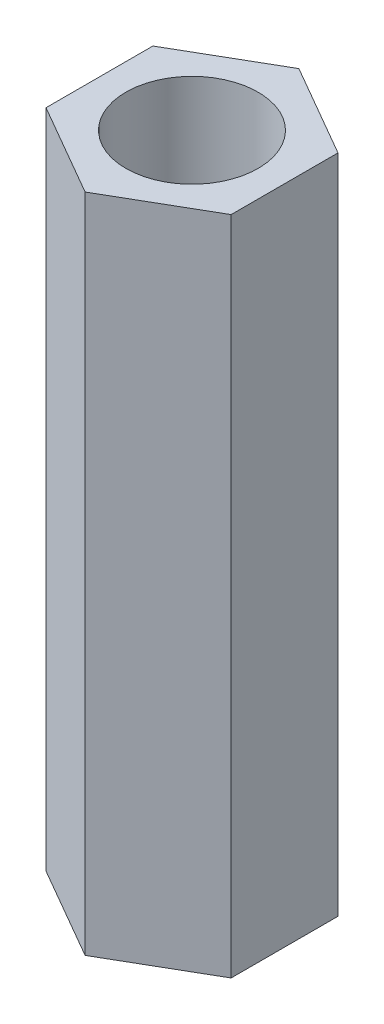
ISO-10303-21;
HEADER;
FILE_DESCRIPTION(('STEP AP214'),'2;1');
FILE_NAME('part.step','',(''),(''),'','','');
FILE_SCHEMA(('AUTOMOTIVE_DESIGN { 1 0 10303 214 1 1 1 1 }'));
ENDSEC;
DATA;
#1=APPLICATION_CONTEXT('core data for automotive mechanical design processes');
#2=APPLICATION_PROTOCOL_DEFINITION('international standard','automotive_design',2000,#1);
#3=PRODUCT_CONTEXT('',#1,'mechanical');
#4=PRODUCT('Part','Part','',(#3));
#5=PRODUCT_RELATED_PRODUCT_CATEGORY('part','',(#4));
#6=PRODUCT_DEFINITION_FORMATION('','',#4);
#7=PRODUCT_DEFINITION_CONTEXT('part definition',#1,'design');
#8=PRODUCT_DEFINITION('design','',#6,#7);
#9=PRODUCT_DEFINITION_SHAPE('','',#8);
#10=(LENGTH_UNIT() NAMED_UNIT(*) SI_UNIT(.MILLI.,.METRE.));
#11=(NAMED_UNIT(*) PLANE_ANGLE_UNIT() SI_UNIT($,.RADIAN.));
#12=(NAMED_UNIT(*) SI_UNIT($,.STERADIAN.) SOLID_ANGLE_UNIT());
#13=UNCERTAINTY_MEASURE_WITH_UNIT(LENGTH_MEASURE(1.E-05),#10,'distance_accuracy_value','');
#14=(GEOMETRIC_REPRESENTATION_CONTEXT(3) GLOBAL_UNCERTAINTY_ASSIGNED_CONTEXT((#13)) GLOBAL_UNIT_ASSIGNED_CONTEXT((#10,
#11,#12)) REPRESENTATION_CONTEXT('',''));
#15=CARTESIAN_POINT('',(0.,0.,0.));
#16=DIRECTION('',(0.,0.,1.));
#17=DIRECTION('',(1.,0.,0.));
#18=AXIS2_PLACEMENT_3D('',#15,#16,#17);
#19=CARTESIAN_POINT('',(0.,10.,0.));
#20=DIRECTION('',(0.,1.,0.));
#21=DIRECTION('',(0.,0.,1.));
#22=AXIS2_PLACEMENT_3D('',#19,#20,#21);
#23=PLANE('',#22);
#24=DIRECTION('',(-0.866025403784439,0.,-0.5));
#25=VECTOR('',#24,1.);
#26=CARTESIAN_POINT('',(1.4,10.,-0.808290376865477));
#27=LINE('',#26,#25);
#28=CARTESIAN_POINT('',(1.4,10.,-0.808290376865477));
#29=VERTEX_POINT('',#28);
#30=CARTESIAN_POINT('',(0.,10.,-1.61658075373095));
#31=VERTEX_POINT('',#30);
#32=EDGE_CURVE('E137',#29,#31,#27,.T.);
#33=ORIENTED_EDGE('',*,*,#32,.T.);
#34=DIRECTION('',(-0.866025403784439,0.,0.5));
#35=VECTOR('',#34,1.);
#36=CARTESIAN_POINT('',(0.,10.,-1.61658075373095));
#37=LINE('',#36,#35);
#38=CARTESIAN_POINT('',(-1.4,10.,-0.808290376865477));
#39=VERTEX_POINT('',#38);
#40=EDGE_CURVE('E95',#31,#39,#37,.T.);
#41=ORIENTED_EDGE('',*,*,#40,.T.);
#42=DIRECTION('',(0.,0.,1.));
#43=VECTOR('',#42,1.);
#44=CARTESIAN_POINT('',(-1.4,10.,-0.808290376865477));
#45=LINE('',#44,#43);
#46=CARTESIAN_POINT('',(-1.4,10.,0.808290376865476));
#47=VERTEX_POINT('',#46);
#48=EDGE_CURVE('E108',#39,#47,#45,.T.);
#49=ORIENTED_EDGE('',*,*,#48,.T.);
#50=DIRECTION('',(0.866025403784439,0.,0.5));
#51=VECTOR('',#50,1.);
#52=CARTESIAN_POINT('',(-1.4,10.,0.808290376865476));
#53=LINE('',#52,#51);
#54=CARTESIAN_POINT('',(0.,10.,1.61658075373095));
#55=VERTEX_POINT('',#54);
#56=EDGE_CURVE('E102',#47,#55,#53,.T.);
#57=ORIENTED_EDGE('',*,*,#56,.T.);
#58=DIRECTION('',(0.866025403784439,0.,-0.5));
#59=VECTOR('',#58,1.);
#60=CARTESIAN_POINT('',(0.,10.,1.61658075373095));
#61=LINE('',#60,#59);
#62=CARTESIAN_POINT('',(1.4,10.,0.808290376865477));
#63=VERTEX_POINT('',#62);
#64=EDGE_CURVE('E106',#55,#63,#61,.T.);
#65=ORIENTED_EDGE('',*,*,#64,.T.);
#66=DIRECTION('',(0.,0.,-1.));
#67=VECTOR('',#66,1.);
#68=CARTESIAN_POINT('',(1.4,10.,0.808290376865477));
#69=LINE('',#68,#67);
#70=EDGE_CURVE('E58',#63,#29,#69,.T.);
#71=ORIENTED_EDGE('',*,*,#70,.T.);
#72=EDGE_LOOP('',(#33,#41,#49,#57,#65,#71));
#73=FACE_BOUND('',#72,.T.);
#74=CARTESIAN_POINT('',(0.,10.,0.));
#75=DIRECTION('',(0.,1.,0.));
#76=DIRECTION('',(0.,0.,1.));
#77=AXIS2_PLACEMENT_3D('',#74,#75,#76);
#78=CIRCLE('',#77,1.);
#79=CARTESIAN_POINT('',(0.,10.,1.));
#80=VERTEX_POINT('',#79);
#81=EDGE_CURVE('E130',#80,#80,#78,.T.);
#82=ORIENTED_EDGE('',*,*,#81,.F.);
#83=EDGE_LOOP('',(#82));
#84=FACE_BOUND('',#83,.T.);
#85=ADVANCED_FACE('F41',(#73,#84),#23,.T.);
#86=CARTESIAN_POINT('',(0.,0.,0.));
#87=DIRECTION('',(0.,1.,0.));
#88=DIRECTION('',(0.,0.,1.));
#89=AXIS2_PLACEMENT_3D('',#86,#87,#88);
#90=PLANE('',#89);
#91=DIRECTION('',(-0.866025403784439,0.,-0.5));
#92=VECTOR('',#91,1.);
#93=CARTESIAN_POINT('',(1.4,0.,-0.808290376865477));
#94=LINE('',#93,#92);
#95=CARTESIAN_POINT('',(1.4,0.,-0.808290376865477));
#96=VERTEX_POINT('',#95);
#97=CARTESIAN_POINT('',(0.,0.,-1.61658075373095));
#98=VERTEX_POINT('',#97);
#99=EDGE_CURVE('E126',#96,#98,#94,.T.);
#100=ORIENTED_EDGE('',*,*,#99,.F.);
#101=DIRECTION('',(0.,0.,-1.));
#102=VECTOR('',#101,1.);
#103=CARTESIAN_POINT('',(1.4,0.,0.808290376865477));
#104=LINE('',#103,#102);
#105=CARTESIAN_POINT('',(1.4,0.,0.808290376865477));
#106=VERTEX_POINT('',#105);
#107=EDGE_CURVE('E87',#106,#96,#104,.T.);
#108=ORIENTED_EDGE('',*,*,#107,.F.);
#109=DIRECTION('',(0.866025403784439,0.,-0.5));
#110=VECTOR('',#109,1.);
#111=CARTESIAN_POINT('',(0.,0.,1.61658075373095));
#112=LINE('',#111,#110);
#113=CARTESIAN_POINT('',(0.,0.,1.61658075373095));
#114=VERTEX_POINT('',#113);
#115=EDGE_CURVE('E81',#114,#106,#112,.T.);
#116=ORIENTED_EDGE('',*,*,#115,.F.);
#117=DIRECTION('',(0.866025403784439,0.,0.5));
#118=VECTOR('',#117,1.);
#119=CARTESIAN_POINT('',(-1.4,0.,0.808290376865476));
#120=LINE('',#119,#118);
#121=CARTESIAN_POINT('',(-1.4,0.,0.808290376865476));
#122=VERTEX_POINT('',#121);
#123=EDGE_CURVE('E116',#122,#114,#120,.T.);
#124=ORIENTED_EDGE('',*,*,#123,.F.);
#125=DIRECTION('',(0.,0.,1.));
#126=VECTOR('',#125,1.);
#127=CARTESIAN_POINT('',(-1.4,0.,-0.808290376865477));
#128=LINE('',#127,#126);
#129=CARTESIAN_POINT('',(-1.4,0.,-0.808290376865477));
#130=VERTEX_POINT('',#129);
#131=EDGE_CURVE('E132',#130,#122,#128,.T.);
#132=ORIENTED_EDGE('',*,*,#131,.F.);
#133=DIRECTION('',(-0.866025403784439,0.,0.5));
#134=VECTOR('',#133,1.);
#135=CARTESIAN_POINT('',(0.,0.,-1.61658075373095));
#136=LINE('',#135,#134);
#137=EDGE_CURVE('E129',#98,#130,#136,.T.);
#138=ORIENTED_EDGE('',*,*,#137,.F.);
#139=EDGE_LOOP('',(#100,#108,#116,#124,#132,#138));
#140=FACE_BOUND('',#139,.T.);
#141=CARTESIAN_POINT('',(0.,0.,0.));
#142=DIRECTION('',(0.,1.,0.));
#143=DIRECTION('',(0.,0.,1.));
#144=AXIS2_PLACEMENT_3D('',#141,#142,#143);
#145=CIRCLE('',#144,1.);
#146=CARTESIAN_POINT('',(0.,0.,1.));
#147=VERTEX_POINT('',#146);
#148=EDGE_CURVE('E230',#147,#147,#145,.T.);
#149=ORIENTED_EDGE('',*,*,#148,.T.);
#150=EDGE_LOOP('',(#149));
#151=FACE_BOUND('',#150,.T.);
#152=ADVANCED_FACE('F146',(#140,#151),#90,.F.);
#153=CARTESIAN_POINT('',(1.4,10.,-0.808290376865477));
#154=DIRECTION('',(-0.5,0.,0.866025403784439));
#155=DIRECTION('',(0.866025403784439,0.,0.5));
#156=AXIS2_PLACEMENT_3D('',#153,#154,#155);
#157=PLANE('',#156);
#158=ORIENTED_EDGE('',*,*,#99,.T.);
#159=DIRECTION('',(0.,-1.,0.));
#160=VECTOR('',#159,1.);
#161=CARTESIAN_POINT('',(0.,10.,-1.61658075373095));
#162=LINE('',#161,#160);
#163=EDGE_CURVE('E11',#31,#98,#162,.T.);
#164=ORIENTED_EDGE('',*,*,#163,.F.);
#165=ORIENTED_EDGE('',*,*,#32,.F.);
#166=DIRECTION('',(0.,-1.,0.));
#167=VECTOR('',#166,1.);
#168=CARTESIAN_POINT('',(1.4,10.,-0.808290376865477));
#169=LINE('',#168,#167);
#170=EDGE_CURVE('E122',#29,#96,#169,.T.);
#171=ORIENTED_EDGE('',*,*,#170,.T.);
#172=EDGE_LOOP('',(#158,#164,#165,#171));
#173=FACE_BOUND('',#172,.T.);
#174=ADVANCED_FACE('F43',(#173),#157,.F.);
#175=CARTESIAN_POINT('',(0.,10.,-1.61658075373095));
#176=DIRECTION('',(0.5,0.,0.866025403784439));
#177=DIRECTION('',(0.866025403784439,0.,-0.5));
#178=AXIS2_PLACEMENT_3D('',#175,#176,#177);
#179=PLANE('',#178);
#180=ORIENTED_EDGE('',*,*,#137,.T.);
#181=DIRECTION('',(0.,-1.,0.));
#182=VECTOR('',#181,1.);
#183=CARTESIAN_POINT('',(-1.4,10.,-0.808290376865477));
#184=LINE('',#183,#182);
#185=EDGE_CURVE('E50',#39,#130,#184,.T.);
#186=ORIENTED_EDGE('',*,*,#185,.F.);
#187=ORIENTED_EDGE('',*,*,#40,.F.);
#188=ORIENTED_EDGE('',*,*,#163,.T.);
#189=EDGE_LOOP('',(#180,#186,#187,#188));
#190=FACE_BOUND('',#189,.T.);
#191=ADVANCED_FACE('F171',(#190),#179,.F.);
#192=CARTESIAN_POINT('',(-1.4,10.,-0.808290376865477));
#193=DIRECTION('',(1.,0.,0.));
#194=DIRECTION('',(0.,0.,-1.));
#195=AXIS2_PLACEMENT_3D('',#192,#193,#194);
#196=PLANE('',#195);
#197=ORIENTED_EDGE('',*,*,#131,.T.);
#198=DIRECTION('',(0.,-1.,0.));
#199=VECTOR('',#198,1.);
#200=CARTESIAN_POINT('',(-1.4,10.,0.808290376865476));
#201=LINE('',#200,#199);
#202=EDGE_CURVE('E117',#47,#122,#201,.T.);
#203=ORIENTED_EDGE('',*,*,#202,.F.);
#204=ORIENTED_EDGE('',*,*,#48,.F.);
#205=ORIENTED_EDGE('',*,*,#185,.T.);
#206=EDGE_LOOP('',(#197,#203,#204,#205));
#207=FACE_BOUND('',#206,.T.);
#208=ADVANCED_FACE('F143',(#207),#196,.F.);
#209=CARTESIAN_POINT('',(-1.4,10.,0.808290376865476));
#210=DIRECTION('',(0.5,0.,-0.866025403784438));
#211=DIRECTION('',(-0.866025403784439,0.,-0.5));
#212=AXIS2_PLACEMENT_3D('',#209,#210,#211);
#213=PLANE('',#212);
#214=ORIENTED_EDGE('',*,*,#123,.T.);
#215=DIRECTION('',(0.,-1.,0.));
#216=VECTOR('',#215,1.);
#217=CARTESIAN_POINT('',(0.,10.,1.61658075373095));
#218=LINE('',#217,#216);
#219=EDGE_CURVE('E113',#55,#114,#218,.T.);
#220=ORIENTED_EDGE('',*,*,#219,.F.);
#221=ORIENTED_EDGE('',*,*,#56,.F.);
#222=ORIENTED_EDGE('',*,*,#202,.T.);
#223=EDGE_LOOP('',(#214,#220,#221,#222));
#224=FACE_BOUND('',#223,.T.);
#225=ADVANCED_FACE('F114',(#224),#213,.F.);
#226=CARTESIAN_POINT('',(0.,10.,1.61658075373095));
#227=DIRECTION('',(-0.5,0.,-0.866025403784439));
#228=DIRECTION('',(-0.866025403784439,0.,0.5));
#229=AXIS2_PLACEMENT_3D('',#226,#227,#228);
#230=PLANE('',#229);
#231=ORIENTED_EDGE('',*,*,#115,.T.);
#232=DIRECTION('',(0.,-1.,0.));
#233=VECTOR('',#232,1.);
#234=CARTESIAN_POINT('',(1.4,10.,0.808290376865477));
#235=LINE('',#234,#233);
#236=EDGE_CURVE('E118',#63,#106,#235,.T.);
#237=ORIENTED_EDGE('',*,*,#236,.F.);
#238=ORIENTED_EDGE('',*,*,#64,.F.);
#239=ORIENTED_EDGE('',*,*,#219,.T.);
#240=EDGE_LOOP('',(#231,#237,#238,#239));
#241=FACE_BOUND('',#240,.T.);
#242=ADVANCED_FACE('F120',(#241),#230,.F.);
#243=CARTESIAN_POINT('',(1.4,10.,0.808290376865477));
#244=DIRECTION('',(-1.,0.,0.));
#245=DIRECTION('',(0.,0.,1.));
#246=AXIS2_PLACEMENT_3D('',#243,#244,#245);
#247=PLANE('',#246);
#248=ORIENTED_EDGE('',*,*,#107,.T.);
#249=ORIENTED_EDGE('',*,*,#170,.F.);
#250=ORIENTED_EDGE('',*,*,#70,.F.);
#251=ORIENTED_EDGE('',*,*,#236,.T.);
#252=EDGE_LOOP('',(#248,#249,#250,#251));
#253=FACE_BOUND('',#252,.T.);
#254=ADVANCED_FACE('F151',(#253),#247,.F.);
#255=CARTESIAN_POINT('',(0.,10.,0.));
#256=DIRECTION('',(0.,-1.,0.));
#257=DIRECTION('',(0.,0.,-1.));
#258=AXIS2_PLACEMENT_3D('',#255,#256,#257);
#259=CYLINDRICAL_SURFACE('',#258,1.);
#260=ORIENTED_EDGE('',*,*,#81,.T.);
#261=EDGE_LOOP('',(#260));
#262=FACE_BOUND('',#261,.T.);
#263=ORIENTED_EDGE('',*,*,#148,.F.);
#264=EDGE_LOOP('',(#263));
#265=FACE_BOUND('',#264,.T.);
#266=ADVANCED_FACE('F153',(#262,#265),#259,.F.);
#267=CLOSED_SHELL('',(#85,#152,#174,#191,#208,#225,#242,#254,#266));
#268=MANIFOLD_SOLID_BREP('B2',#267);
#269=ADVANCED_BREP_SHAPE_REPRESENTATION('',(#18,#268),#14);
#270=SHAPE_DEFINITION_REPRESENTATION(#9,#269);
ENDSEC;
END-ISO-10303-21;
